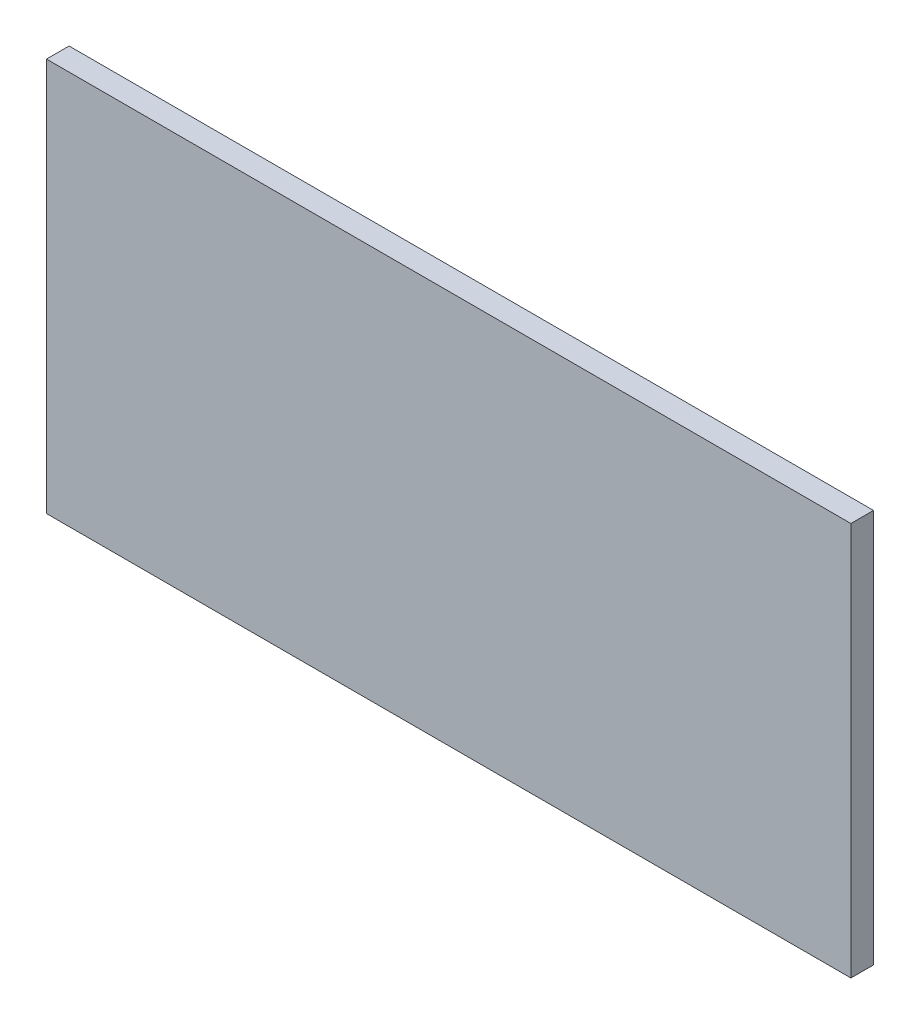
ISO-10303-21;
HEADER;
FILE_DESCRIPTION(('STEP AP214'),'2;1');
FILE_NAME('part.step','',(''),(''),'','','');
FILE_SCHEMA(('AUTOMOTIVE_DESIGN { 1 0 10303 214 1 1 1 1 }'));
ENDSEC;
DATA;
#1=APPLICATION_CONTEXT('core data for automotive mechanical design processes');
#2=APPLICATION_PROTOCOL_DEFINITION('international standard','automotive_design',2000,#1);
#3=PRODUCT_CONTEXT('',#1,'mechanical');
#4=PRODUCT('Part','Part','',(#3));
#5=PRODUCT_RELATED_PRODUCT_CATEGORY('part','',(#4));
#6=PRODUCT_DEFINITION_FORMATION('','',#4);
#7=PRODUCT_DEFINITION_CONTEXT('part definition',#1,'design');
#8=PRODUCT_DEFINITION('design','',#6,#7);
#9=PRODUCT_DEFINITION_SHAPE('','',#8);
#10=(LENGTH_UNIT() NAMED_UNIT(*) SI_UNIT(.MILLI.,.METRE.));
#11=(NAMED_UNIT(*) PLANE_ANGLE_UNIT() SI_UNIT($,.RADIAN.));
#12=(NAMED_UNIT(*) SI_UNIT($,.STERADIAN.) SOLID_ANGLE_UNIT());
#13=UNCERTAINTY_MEASURE_WITH_UNIT(LENGTH_MEASURE(1.E-05),#10,'distance_accuracy_value','');
#14=(GEOMETRIC_REPRESENTATION_CONTEXT(3) GLOBAL_UNCERTAINTY_ASSIGNED_CONTEXT((#13)) GLOBAL_UNIT_ASSIGNED_CONTEXT((#10,
#11,#12)) REPRESENTATION_CONTEXT('',''));
#15=CARTESIAN_POINT('',(0.,0.,0.));
#16=DIRECTION('',(0.,0.,1.));
#17=DIRECTION('',(1.,0.,0.));
#18=AXIS2_PLACEMENT_3D('',#15,#16,#17);
#19=CARTESIAN_POINT('',(5.01,-876.5,0.));
#20=DIRECTION('',(0.,0.,1.));
#21=DIRECTION('',(1.,0.,0.));
#22=AXIS2_PLACEMENT_3D('',#19,#20,#21);
#23=PLANE('',#22);
#24=DIRECTION('',(1.,0.,0.));
#25=VECTOR('',#24,1.);
#26=CARTESIAN_POINT('',(-83.89,-833.,0.));
#27=LINE('',#26,#25);
#28=CARTESIAN_POINT('',(-83.89,-833.,0.));
#29=VERTEX_POINT('',#28);
#30=CARTESIAN_POINT('',(93.91,-833.,0.));
#31=VERTEX_POINT('',#30);
#32=EDGE_CURVE('E27',#29,#31,#27,.T.);
#33=ORIENTED_EDGE('',*,*,#32,.T.);
#34=DIRECTION('',(0.,-1.,0.));
#35=VECTOR('',#34,1.);
#36=CARTESIAN_POINT('',(93.91,-833.,0.));
#37=LINE('',#36,#35);
#38=CARTESIAN_POINT('',(93.91,-920.,0.));
#39=VERTEX_POINT('',#38);
#40=EDGE_CURVE('E92',#31,#39,#37,.T.);
#41=ORIENTED_EDGE('',*,*,#40,.T.);
#42=DIRECTION('',(-1.,0.,0.));
#43=VECTOR('',#42,1.);
#44=CARTESIAN_POINT('',(93.91,-920.,0.));
#45=LINE('',#44,#43);
#46=CARTESIAN_POINT('',(-83.89,-920.,0.));
#47=VERTEX_POINT('',#46);
#48=EDGE_CURVE('E78',#39,#47,#45,.T.);
#49=ORIENTED_EDGE('',*,*,#48,.T.);
#50=DIRECTION('',(0.,1.,0.));
#51=VECTOR('',#50,1.);
#52=CARTESIAN_POINT('',(-83.89,-920.,0.));
#53=LINE('',#52,#51);
#54=EDGE_CURVE('E57',#47,#29,#53,.T.);
#55=ORIENTED_EDGE('',*,*,#54,.T.);
#56=EDGE_LOOP('',(#33,#41,#49,#55));
#57=FACE_BOUND('',#56,.T.);
#58=ADVANCED_FACE('F17',(#57),#23,.F.);
#59=CARTESIAN_POINT('',(5.01,-876.5,5.));
#60=DIRECTION('',(0.,0.,1.));
#61=DIRECTION('',(1.,0.,0.));
#62=AXIS2_PLACEMENT_3D('',#59,#60,#61);
#63=PLANE('',#62);
#64=DIRECTION('',(-1.,0.,0.));
#65=VECTOR('',#64,1.);
#66=CARTESIAN_POINT('',(-83.89,-833.,5.));
#67=LINE('',#66,#65);
#68=CARTESIAN_POINT('',(93.91,-833.,5.));
#69=VERTEX_POINT('',#68);
#70=CARTESIAN_POINT('',(-83.89,-833.,5.));
#71=VERTEX_POINT('',#70);
#72=EDGE_CURVE('E11',#69,#71,#67,.T.);
#73=ORIENTED_EDGE('',*,*,#72,.T.);
#74=DIRECTION('',(0.,-1.,0.));
#75=VECTOR('',#74,1.);
#76=CARTESIAN_POINT('',(-83.89,-920.,5.));
#77=LINE('',#76,#75);
#78=CARTESIAN_POINT('',(-83.89,-920.,5.));
#79=VERTEX_POINT('',#78);
#80=EDGE_CURVE('E48',#71,#79,#77,.T.);
#81=ORIENTED_EDGE('',*,*,#80,.T.);
#82=DIRECTION('',(1.,0.,0.));
#83=VECTOR('',#82,1.);
#84=CARTESIAN_POINT('',(93.91,-920.,5.));
#85=LINE('',#84,#83);
#86=CARTESIAN_POINT('',(93.91,-920.,5.));
#87=VERTEX_POINT('',#86);
#88=EDGE_CURVE('E66',#79,#87,#85,.T.);
#89=ORIENTED_EDGE('',*,*,#88,.T.);
#90=DIRECTION('',(0.,1.,0.));
#91=VECTOR('',#90,1.);
#92=CARTESIAN_POINT('',(93.91,-833.,5.));
#93=LINE('',#92,#91);
#94=EDGE_CURVE('E93',#87,#69,#93,.T.);
#95=ORIENTED_EDGE('',*,*,#94,.T.);
#96=EDGE_LOOP('',(#73,#81,#89,#95));
#97=FACE_BOUND('',#96,.T.);
#98=ADVANCED_FACE('F128',(#97),#63,.T.);
#99=CARTESIAN_POINT('',(93.91,-833.,0.));
#100=DIRECTION('',(0.,1.,0.));
#101=DIRECTION('',(1.,0.,0.));
#102=AXIS2_PLACEMENT_3D('',#99,#100,#101);
#103=PLANE('',#102);
#104=ORIENTED_EDGE('',*,*,#32,.F.);
#105=DIRECTION('',(0.,0.,1.));
#106=VECTOR('',#105,1.);
#107=CARTESIAN_POINT('',(-83.89,-833.,0.));
#108=LINE('',#107,#106);
#109=EDGE_CURVE('E115',#29,#71,#108,.T.);
#110=ORIENTED_EDGE('',*,*,#109,.T.);
#111=ORIENTED_EDGE('',*,*,#72,.F.);
#112=DIRECTION('',(0.,0.,1.));
#113=VECTOR('',#112,1.);
#114=CARTESIAN_POINT('',(93.91,-833.,0.));
#115=LINE('',#114,#113);
#116=EDGE_CURVE('E98',#31,#69,#115,.T.);
#117=ORIENTED_EDGE('',*,*,#116,.F.);
#118=EDGE_LOOP('',(#104,#110,#111,#117));
#119=FACE_BOUND('',#118,.T.);
#120=ADVANCED_FACE('F19',(#119),#103,.T.);
#121=CARTESIAN_POINT('',(-83.89,-833.,0.));
#122=DIRECTION('',(-1.,0.,0.));
#123=DIRECTION('',(0.,0.,1.));
#124=AXIS2_PLACEMENT_3D('',#121,#122,#123);
#125=PLANE('',#124);
#126=ORIENTED_EDGE('',*,*,#54,.F.);
#127=DIRECTION('',(0.,0.,1.));
#128=VECTOR('',#127,1.);
#129=CARTESIAN_POINT('',(-83.89,-920.,0.));
#130=LINE('',#129,#128);
#131=EDGE_CURVE('E83',#47,#79,#130,.T.);
#132=ORIENTED_EDGE('',*,*,#131,.T.);
#133=ORIENTED_EDGE('',*,*,#80,.F.);
#134=ORIENTED_EDGE('',*,*,#109,.F.);
#135=EDGE_LOOP('',(#126,#132,#133,#134));
#136=FACE_BOUND('',#135,.T.);
#137=ADVANCED_FACE('F120',(#136),#125,.T.);
#138=CARTESIAN_POINT('',(-83.89,-920.,0.));
#139=DIRECTION('',(0.,-1.,0.));
#140=DIRECTION('',(0.,0.,-1.));
#141=AXIS2_PLACEMENT_3D('',#138,#139,#140);
#142=PLANE('',#141);
#143=ORIENTED_EDGE('',*,*,#48,.F.);
#144=DIRECTION('',(0.,0.,1.));
#145=VECTOR('',#144,1.);
#146=CARTESIAN_POINT('',(93.91,-920.,0.));
#147=LINE('',#146,#145);
#148=EDGE_CURVE('E81',#39,#87,#147,.T.);
#149=ORIENTED_EDGE('',*,*,#148,.T.);
#150=ORIENTED_EDGE('',*,*,#88,.F.);
#151=ORIENTED_EDGE('',*,*,#131,.F.);
#152=EDGE_LOOP('',(#143,#149,#150,#151));
#153=FACE_BOUND('',#152,.T.);
#154=ADVANCED_FACE('F80',(#153),#142,.T.);
#155=CARTESIAN_POINT('',(93.91,-920.,0.));
#156=DIRECTION('',(1.,0.,0.));
#157=DIRECTION('',(0.,-1.,0.));
#158=AXIS2_PLACEMENT_3D('',#155,#156,#157);
#159=PLANE('',#158);
#160=ORIENTED_EDGE('',*,*,#40,.F.);
#161=ORIENTED_EDGE('',*,*,#116,.T.);
#162=ORIENTED_EDGE('',*,*,#94,.F.);
#163=ORIENTED_EDGE('',*,*,#148,.F.);
#164=EDGE_LOOP('',(#160,#161,#162,#163));
#165=FACE_BOUND('',#164,.T.);
#166=ADVANCED_FACE('F90',(#165),#159,.T.);
#167=CLOSED_SHELL('',(#58,#98,#120,#137,#154,#166));
#168=MANIFOLD_SOLID_BREP('B1',#167);
#169=ADVANCED_BREP_SHAPE_REPRESENTATION('',(#18,#168),#14);
#170=SHAPE_DEFINITION_REPRESENTATION(#9,#169);
ENDSEC;
END-ISO-10303-21;
